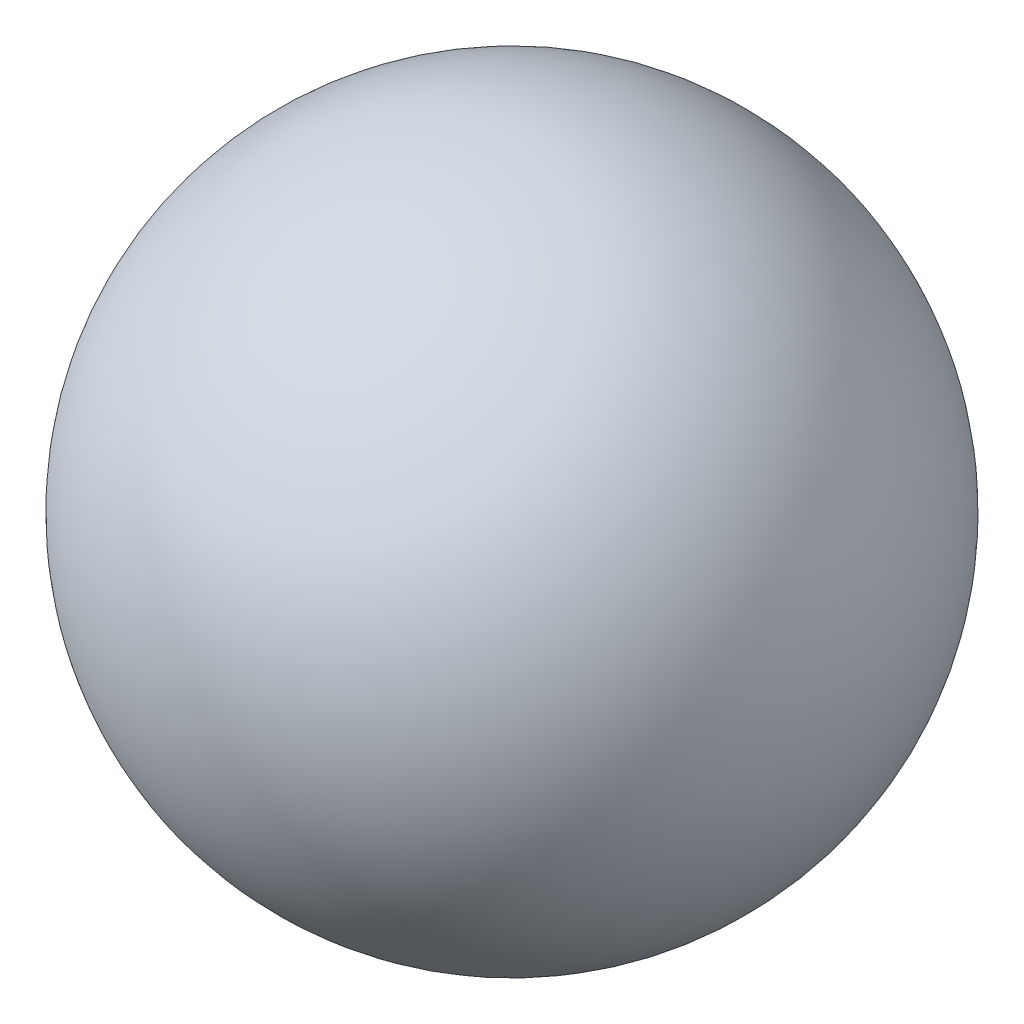
ISO-10303-21;
HEADER;
FILE_DESCRIPTION(('STEP AP214'),'2;1');
FILE_NAME('part.step','',(''),(''),'','','');
FILE_SCHEMA(('AUTOMOTIVE_DESIGN { 1 0 10303 214 1 1 1 1 }'));
ENDSEC;
DATA;
#1=APPLICATION_CONTEXT('core data for automotive mechanical design processes');
#2=APPLICATION_PROTOCOL_DEFINITION('international standard','automotive_design',2000,#1);
#3=PRODUCT_CONTEXT('',#1,'mechanical');
#4=PRODUCT('Part','Part','',(#3));
#5=PRODUCT_RELATED_PRODUCT_CATEGORY('part','',(#4));
#6=PRODUCT_DEFINITION_FORMATION('','',#4);
#7=PRODUCT_DEFINITION_CONTEXT('part definition',#1,'design');
#8=PRODUCT_DEFINITION('design','',#6,#7);
#9=PRODUCT_DEFINITION_SHAPE('','',#8);
#10=(LENGTH_UNIT() NAMED_UNIT(*) SI_UNIT(.MILLI.,.METRE.));
#11=(NAMED_UNIT(*) PLANE_ANGLE_UNIT() SI_UNIT($,.RADIAN.));
#12=(NAMED_UNIT(*) SI_UNIT($,.STERADIAN.) SOLID_ANGLE_UNIT());
#13=UNCERTAINTY_MEASURE_WITH_UNIT(LENGTH_MEASURE(1.E-05),#10,'distance_accuracy_value','');
#14=(GEOMETRIC_REPRESENTATION_CONTEXT(3) GLOBAL_UNCERTAINTY_ASSIGNED_CONTEXT((#13)) GLOBAL_UNIT_ASSIGNED_CONTEXT((#10,
#11,#12)) REPRESENTATION_CONTEXT('',''));
#15=CARTESIAN_POINT('',(0.,0.,0.));
#16=DIRECTION('',(0.,0.,1.));
#17=DIRECTION('',(1.,0.,0.));
#18=AXIS2_PLACEMENT_3D('',#15,#16,#17);
#19=CARTESIAN_POINT('',(0.,0.,0.));
#20=DIRECTION('',(0.,0.,-1.));
#21=DIRECTION('',(1.,0.,0.));
#22=AXIS2_PLACEMENT_3D('',#19,#20,#21);
#23=SPHERICAL_SURFACE('',#22,4.7625);
#24=CARTESIAN_POINT('',(0.,0.,-4.7625));
#25=VERTEX_POINT('',#24);
#26=VERTEX_LOOP('',#25);
#27=FACE_BOUND('',#26,.T.);
#28=ADVANCED_FACE('F29',(#27),#23,.T.);
#29=CLOSED_SHELL('',(#28));
#30=MANIFOLD_SOLID_BREP('B2',#29);
#31=ADVANCED_BREP_SHAPE_REPRESENTATION('',(#18,#30),#14);
#32=SHAPE_DEFINITION_REPRESENTATION(#9,#31);
ENDSEC;
END-ISO-10303-21;
